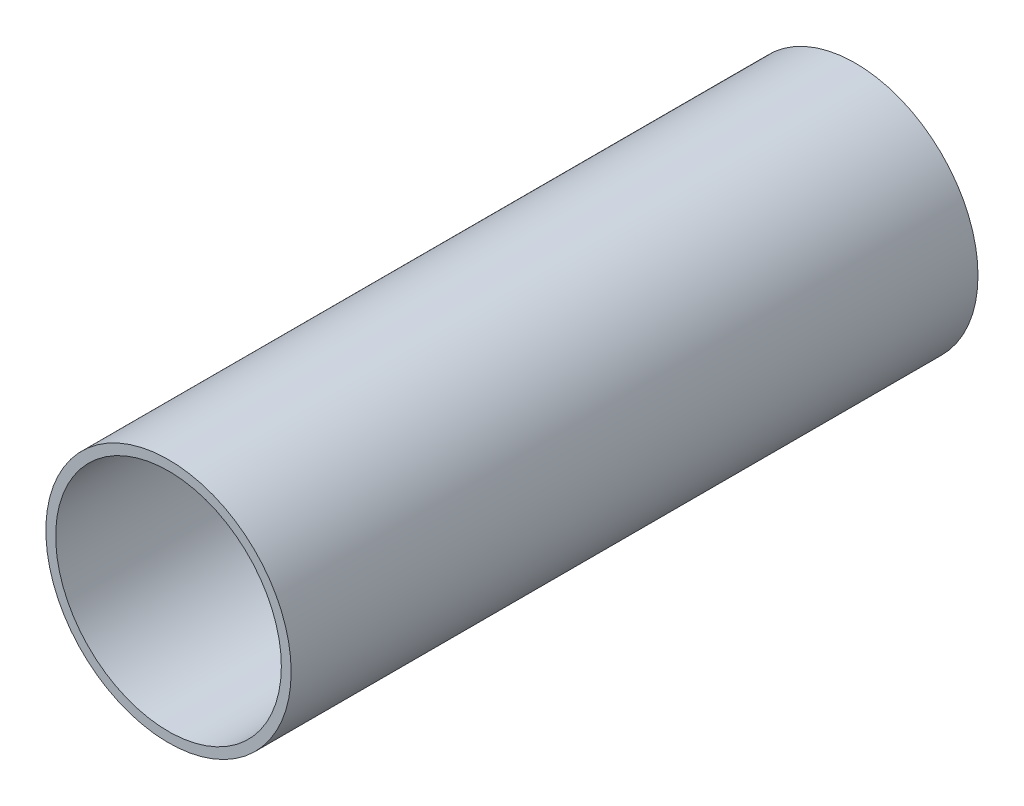
ISO-10303-21;
HEADER;
FILE_DESCRIPTION(('STEP AP214'),'2;1');
FILE_NAME('part.step','',(''),(''),'','','');
FILE_SCHEMA(('AUTOMOTIVE_DESIGN { 1 0 10303 214 1 1 1 1 }'));
ENDSEC;
DATA;
#1=APPLICATION_CONTEXT('core data for automotive mechanical design processes');
#2=APPLICATION_PROTOCOL_DEFINITION('international standard','automotive_design',2000,#1);
#3=PRODUCT_CONTEXT('',#1,'mechanical');
#4=PRODUCT('Part','Part','',(#3));
#5=PRODUCT_RELATED_PRODUCT_CATEGORY('part','',(#4));
#6=PRODUCT_DEFINITION_FORMATION('','',#4);
#7=PRODUCT_DEFINITION_CONTEXT('part definition',#1,'design');
#8=PRODUCT_DEFINITION('design','',#6,#7);
#9=PRODUCT_DEFINITION_SHAPE('','',#8);
#10=(LENGTH_UNIT() NAMED_UNIT(*) SI_UNIT(.MILLI.,.METRE.));
#11=(NAMED_UNIT(*) PLANE_ANGLE_UNIT() SI_UNIT($,.RADIAN.));
#12=(NAMED_UNIT(*) SI_UNIT($,.STERADIAN.) SOLID_ANGLE_UNIT());
#13=UNCERTAINTY_MEASURE_WITH_UNIT(LENGTH_MEASURE(1.E-05),#10,'distance_accuracy_value','');
#14=(GEOMETRIC_REPRESENTATION_CONTEXT(3) GLOBAL_UNCERTAINTY_ASSIGNED_CONTEXT((#13)) GLOBAL_UNIT_ASSIGNED_CONTEXT((#10,
#11,#12)) REPRESENTATION_CONTEXT('',''));
#15=CARTESIAN_POINT('',(0.,0.,0.));
#16=DIRECTION('',(0.,0.,1.));
#17=DIRECTION('',(1.,0.,0.));
#18=AXIS2_PLACEMENT_3D('',#15,#16,#17);
#19=CARTESIAN_POINT('',(0.,0.,-100.));
#20=DIRECTION('',(0.,0.,1.));
#21=DIRECTION('',(1.,0.,0.));
#22=AXIS2_PLACEMENT_3D('',#19,#20,#21);
#23=CYLINDRICAL_SURFACE('',#22,25.);
#24=CARTESIAN_POINT('',(0.,0.,-100.));
#25=DIRECTION('',(0.,0.,1.));
#26=DIRECTION('',(1.,0.,0.));
#27=AXIS2_PLACEMENT_3D('',#24,#25,#26);
#28=CIRCLE('',#27,25.);
#29=CARTESIAN_POINT('',(25.,0.,-100.));
#30=VERTEX_POINT('',#29);
#31=EDGE_CURVE('E10',#30,#30,#28,.T.);
#32=ORIENTED_EDGE('',*,*,#31,.T.);
#33=EDGE_LOOP('',(#32));
#34=FACE_BOUND('',#33,.T.);
#35=CARTESIAN_POINT('',(0.,0.,40.));
#36=DIRECTION('',(0.,0.,1.));
#37=DIRECTION('',(1.,0.,0.));
#38=AXIS2_PLACEMENT_3D('',#35,#36,#37);
#39=CIRCLE('',#38,25.);
#40=CARTESIAN_POINT('',(25.,0.,40.));
#41=VERTEX_POINT('',#40);
#42=EDGE_CURVE('E43',#41,#41,#39,.T.);
#43=ORIENTED_EDGE('',*,*,#42,.F.);
#44=EDGE_LOOP('',(#43));
#45=FACE_BOUND('',#44,.T.);
#46=ADVANCED_FACE('F33',(#34,#45),#23,.T.);
#47=CARTESIAN_POINT('',(0.,0.,-100.));
#48=DIRECTION('',(0.,0.,1.));
#49=DIRECTION('',(1.,0.,0.));
#50=AXIS2_PLACEMENT_3D('',#47,#48,#49);
#51=PLANE('',#50);
#52=CARTESIAN_POINT('',(0.,0.,-100.));
#53=DIRECTION('',(0.,0.,1.));
#54=DIRECTION('',(1.,0.,0.));
#55=AXIS2_PLACEMENT_3D('',#52,#53,#54);
#56=CIRCLE('',#55,23.);
#57=CARTESIAN_POINT('',(23.,0.,-100.));
#58=VERTEX_POINT('',#57);
#59=EDGE_CURVE('E39',#58,#58,#56,.T.);
#60=ORIENTED_EDGE('',*,*,#59,.T.);
#61=EDGE_LOOP('',(#60));
#62=FACE_BOUND('',#61,.T.);
#63=ORIENTED_EDGE('',*,*,#31,.F.);
#64=EDGE_LOOP('',(#63));
#65=FACE_BOUND('',#64,.T.);
#66=ADVANCED_FACE('F62',(#62,#65),#51,.F.);
#67=CARTESIAN_POINT('',(0.,0.,-100.));
#68=DIRECTION('',(0.,0.,1.));
#69=DIRECTION('',(1.,0.,0.));
#70=AXIS2_PLACEMENT_3D('',#67,#68,#69);
#71=CYLINDRICAL_SURFACE('',#70,23.);
#72=ORIENTED_EDGE('',*,*,#59,.F.);
#73=EDGE_LOOP('',(#72));
#74=FACE_BOUND('',#73,.T.);
#75=CARTESIAN_POINT('',(0.,0.,40.));
#76=DIRECTION('',(0.,0.,1.));
#77=DIRECTION('',(1.,0.,0.));
#78=AXIS2_PLACEMENT_3D('',#75,#76,#77);
#79=CIRCLE('',#78,23.);
#80=CARTESIAN_POINT('',(23.,0.,40.));
#81=VERTEX_POINT('',#80);
#82=EDGE_CURVE('E47',#81,#81,#79,.T.);
#83=ORIENTED_EDGE('',*,*,#82,.T.);
#84=EDGE_LOOP('',(#83));
#85=FACE_BOUND('',#84,.T.);
#86=ADVANCED_FACE('F53',(#74,#85),#71,.F.);
#87=CARTESIAN_POINT('',(0.,0.,40.));
#88=DIRECTION('',(0.,0.,1.));
#89=DIRECTION('',(1.,0.,0.));
#90=AXIS2_PLACEMENT_3D('',#87,#88,#89);
#91=PLANE('',#90);
#92=ORIENTED_EDGE('',*,*,#42,.T.);
#93=EDGE_LOOP('',(#92));
#94=FACE_BOUND('',#93,.T.);
#95=ORIENTED_EDGE('',*,*,#82,.F.);
#96=EDGE_LOOP('',(#95));
#97=FACE_BOUND('',#96,.T.);
#98=ADVANCED_FACE('F55',(#94,#97),#91,.T.);
#99=CLOSED_SHELL('',(#46,#66,#86,#98));
#100=MANIFOLD_SOLID_BREP('B2',#99);
#101=ADVANCED_BREP_SHAPE_REPRESENTATION('',(#18,#100),#14);
#102=SHAPE_DEFINITION_REPRESENTATION(#9,#101);
ENDSEC;
END-ISO-10303-21;
